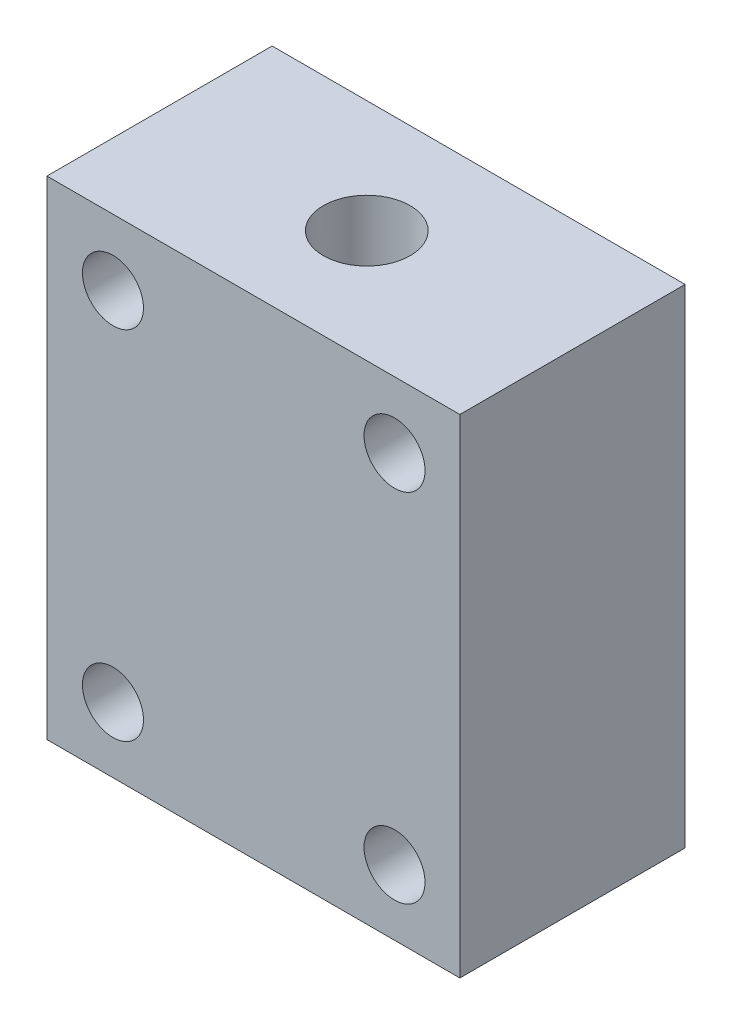
ISO-10303-21;
HEADER;
FILE_DESCRIPTION(('STEP AP214'),'2;1');
FILE_NAME('part.step','',(''),(''),'','','');
FILE_SCHEMA(('AUTOMOTIVE_DESIGN { 1 0 10303 214 1 1 1 1 }'));
ENDSEC;
DATA;
#1=APPLICATION_CONTEXT('core data for automotive mechanical design processes');
#2=APPLICATION_PROTOCOL_DEFINITION('international standard','automotive_design',2000,#1);
#3=PRODUCT_CONTEXT('',#1,'mechanical');
#4=PRODUCT('Part','Part','',(#3));
#5=PRODUCT_RELATED_PRODUCT_CATEGORY('part','',(#4));
#6=PRODUCT_DEFINITION_FORMATION('','',#4);
#7=PRODUCT_DEFINITION_CONTEXT('part definition',#1,'design');
#8=PRODUCT_DEFINITION('design','',#6,#7);
#9=PRODUCT_DEFINITION_SHAPE('','',#8);
#10=(LENGTH_UNIT() NAMED_UNIT(*) SI_UNIT(.MILLI.,.METRE.));
#11=(NAMED_UNIT(*) PLANE_ANGLE_UNIT() SI_UNIT($,.RADIAN.));
#12=(NAMED_UNIT(*) SI_UNIT($,.STERADIAN.) SOLID_ANGLE_UNIT());
#13=UNCERTAINTY_MEASURE_WITH_UNIT(LENGTH_MEASURE(1.E-05),#10,'distance_accuracy_value','');
#14=(GEOMETRIC_REPRESENTATION_CONTEXT(3) GLOBAL_UNCERTAINTY_ASSIGNED_CONTEXT((#13)) GLOBAL_UNIT_ASSIGNED_CONTEXT((#10,
#11,#12)) REPRESENTATION_CONTEXT('',''));
#15=CARTESIAN_POINT('',(0.,0.,0.));
#16=DIRECTION('',(0.,0.,1.));
#17=DIRECTION('',(1.,0.,0.));
#18=AXIS2_PLACEMENT_3D('',#15,#16,#17);
#19=CARTESIAN_POINT('',(34.925,41.275,19.05));
#20=DIRECTION('',(0.,-1.,0.));
#21=DIRECTION('',(0.,0.,-1.));
#22=AXIS2_PLACEMENT_3D('',#19,#20,#21);
#23=PLANE('',#22);
#24=CARTESIAN_POINT('',(0.126999999999997,41.275,0.));
#25=DIRECTION('',(0.,1.,0.));
#26=DIRECTION('',(0.,0.,1.));
#27=AXIS2_PLACEMENT_3D('',#24,#25,#26);
#28=CIRCLE('',#27,7.3421875);
#29=CARTESIAN_POINT('',(0.126999999999997,41.275,7.3421875));
#30=VERTEX_POINT('',#29);
#31=EDGE_CURVE('E227',#30,#30,#28,.T.);
#32=ORIENTED_EDGE('',*,*,#31,.F.);
#33=EDGE_LOOP('',(#32));
#34=FACE_BOUND('',#33,.T.);
#35=DIRECTION('',(-1.,0.,0.));
#36=VECTOR('',#35,1.);
#37=CARTESIAN_POINT('',(34.925,41.275,-19.05));
#38=LINE('',#37,#36);
#39=CARTESIAN_POINT('',(34.925,41.275,-19.05));
#40=VERTEX_POINT('',#39);
#41=CARTESIAN_POINT('',(-34.925,41.275,-19.05));
#42=VERTEX_POINT('',#41);
#43=EDGE_CURVE('E181',#40,#42,#38,.T.);
#44=ORIENTED_EDGE('',*,*,#43,.T.);
#45=DIRECTION('',(0.,0.,-1.));
#46=VECTOR('',#45,1.);
#47=CARTESIAN_POINT('',(-34.925,41.275,19.05));
#48=LINE('',#47,#46);
#49=CARTESIAN_POINT('',(-34.925,41.275,19.05));
#50=VERTEX_POINT('',#49);
#51=EDGE_CURVE('E210',#50,#42,#48,.T.);
#52=ORIENTED_EDGE('',*,*,#51,.F.);
#53=DIRECTION('',(-1.,0.,0.));
#54=VECTOR('',#53,1.);
#55=CARTESIAN_POINT('',(34.925,41.275,19.05));
#56=LINE('',#55,#54);
#57=CARTESIAN_POINT('',(34.925,41.275,19.05));
#58=VERTEX_POINT('',#57);
#59=EDGE_CURVE('E184',#58,#50,#56,.T.);
#60=ORIENTED_EDGE('',*,*,#59,.F.);
#61=DIRECTION('',(0.,0.,-1.));
#62=VECTOR('',#61,1.);
#63=CARTESIAN_POINT('',(34.925,41.275,19.05));
#64=LINE('',#63,#62);
#65=EDGE_CURVE('E194',#58,#40,#64,.T.);
#66=ORIENTED_EDGE('',*,*,#65,.T.);
#67=EDGE_LOOP('',(#44,#52,#60,#66));
#68=FACE_BOUND('',#67,.T.);
#69=ADVANCED_FACE('F43',(#34,#68),#23,.F.);
#70=CARTESIAN_POINT('',(-34.925,-41.275,19.05));
#71=DIRECTION('',(1.,0.,0.));
#72=DIRECTION('',(0.,0.,-1.));
#73=AXIS2_PLACEMENT_3D('',#70,#71,#72);
#74=PLANE('',#73);
#75=DIRECTION('',(0.,-1.,0.));
#76=VECTOR('',#75,1.);
#77=CARTESIAN_POINT('',(-34.925,-41.275,-19.05));
#78=LINE('',#77,#76);
#79=CARTESIAN_POINT('',(-34.925,-41.275,-19.05));
#80=VERTEX_POINT('',#79);
#81=EDGE_CURVE('E197',#42,#80,#78,.T.);
#82=ORIENTED_EDGE('',*,*,#81,.T.);
#83=DIRECTION('',(0.,0.,-1.));
#84=VECTOR('',#83,1.);
#85=CARTESIAN_POINT('',(-34.925,-41.275,19.05));
#86=LINE('',#85,#84);
#87=CARTESIAN_POINT('',(-34.925,-41.275,19.05));
#88=VERTEX_POINT('',#87);
#89=EDGE_CURVE('E207',#88,#80,#86,.T.);
#90=ORIENTED_EDGE('',*,*,#89,.F.);
#91=DIRECTION('',(0.,-1.,0.));
#92=VECTOR('',#91,1.);
#93=CARTESIAN_POINT('',(-34.925,-41.275,19.05));
#94=LINE('',#93,#92);
#95=EDGE_CURVE('E187',#50,#88,#94,.T.);
#96=ORIENTED_EDGE('',*,*,#95,.F.);
#97=ORIENTED_EDGE('',*,*,#51,.T.);
#98=EDGE_LOOP('',(#82,#90,#96,#97));
#99=FACE_BOUND('',#98,.T.);
#100=ADVANCED_FACE('F235',(#99),#74,.F.);
#101=CARTESIAN_POINT('',(34.925,-41.275,19.05));
#102=DIRECTION('',(0.,1.,0.));
#103=DIRECTION('',(0.,0.,1.));
#104=AXIS2_PLACEMENT_3D('',#101,#102,#103);
#105=PLANE('',#104);
#106=DIRECTION('',(1.,0.,0.));
#107=VECTOR('',#106,1.);
#108=CARTESIAN_POINT('',(34.925,-41.275,-19.05));
#109=LINE('',#108,#107);
#110=CARTESIAN_POINT('',(34.925,-41.275,-19.05));
#111=VERTEX_POINT('',#110);
#112=EDGE_CURVE('E199',#80,#111,#109,.T.);
#113=ORIENTED_EDGE('',*,*,#112,.T.);
#114=DIRECTION('',(0.,0.,-1.));
#115=VECTOR('',#114,1.);
#116=CARTESIAN_POINT('',(34.925,-41.275,19.05));
#117=LINE('',#116,#115);
#118=CARTESIAN_POINT('',(34.925,-41.275,19.05));
#119=VERTEX_POINT('',#118);
#120=EDGE_CURVE('E204',#119,#111,#117,.T.);
#121=ORIENTED_EDGE('',*,*,#120,.F.);
#122=DIRECTION('',(1.,0.,0.));
#123=VECTOR('',#122,1.);
#124=CARTESIAN_POINT('',(34.925,-41.275,19.05));
#125=LINE('',#124,#123);
#126=EDGE_CURVE('E190',#88,#119,#125,.T.);
#127=ORIENTED_EDGE('',*,*,#126,.F.);
#128=ORIENTED_EDGE('',*,*,#89,.T.);
#129=EDGE_LOOP('',(#113,#121,#127,#128));
#130=FACE_BOUND('',#129,.T.);
#131=ADVANCED_FACE('F254',(#130),#105,.F.);
#132=CARTESIAN_POINT('',(34.925,-41.275,19.05));
#133=DIRECTION('',(-1.,0.,0.));
#134=DIRECTION('',(0.,0.,1.));
#135=AXIS2_PLACEMENT_3D('',#132,#133,#134);
#136=PLANE('',#135);
#137=DIRECTION('',(0.,1.,0.));
#138=VECTOR('',#137,1.);
#139=CARTESIAN_POINT('',(34.925,-41.275,-19.05));
#140=LINE('',#139,#138);
#141=EDGE_CURVE('E188',#111,#40,#140,.T.);
#142=ORIENTED_EDGE('',*,*,#141,.T.);
#143=ORIENTED_EDGE('',*,*,#65,.F.);
#144=DIRECTION('',(0.,1.,0.));
#145=VECTOR('',#144,1.);
#146=CARTESIAN_POINT('',(34.925,-41.275,19.05));
#147=LINE('',#146,#145);
#148=EDGE_CURVE('E192',#119,#58,#147,.T.);
#149=ORIENTED_EDGE('',*,*,#148,.F.);
#150=ORIENTED_EDGE('',*,*,#120,.T.);
#151=EDGE_LOOP('',(#142,#143,#149,#150));
#152=FACE_BOUND('',#151,.T.);
#153=ADVANCED_FACE('F252',(#152),#136,.F.);
#154=CARTESIAN_POINT('',(0.,0.,19.05));
#155=DIRECTION('',(0.,0.,-1.));
#156=DIRECTION('',(-1.,0.,0.));
#157=AXIS2_PLACEMENT_3D('',#154,#155,#156);
#158=PLANE('',#157);
#159=CARTESIAN_POINT('',(23.876,30.099,19.05));
#160=DIRECTION('',(0.,0.,-1.));
#161=DIRECTION('',(-1.,0.,0.));
#162=AXIS2_PLACEMENT_3D('',#159,#160,#161);
#163=CIRCLE('',#162,5.159375);
#164=CARTESIAN_POINT('',(18.716625,30.099,19.05));
#165=VERTEX_POINT('',#164);
#166=EDGE_CURVE('E164',#165,#165,#163,.T.);
#167=ORIENTED_EDGE('',*,*,#166,.T.);
#168=EDGE_LOOP('',(#167));
#169=FACE_BOUND('',#168,.T.);
#170=CARTESIAN_POINT('',(-23.749,-30.226,19.05));
#171=DIRECTION('',(0.,0.,-1.));
#172=DIRECTION('',(-1.,0.,0.));
#173=AXIS2_PLACEMENT_3D('',#170,#171,#172);
#174=CIRCLE('',#173,5.159375);
#175=CARTESIAN_POINT('',(-28.908375,-30.226,19.05));
#176=VERTEX_POINT('',#175);
#177=EDGE_CURVE('E167',#176,#176,#174,.T.);
#178=ORIENTED_EDGE('',*,*,#177,.T.);
#179=EDGE_LOOP('',(#178));
#180=FACE_BOUND('',#179,.T.);
#181=CARTESIAN_POINT('',(-23.749,30.099,19.05));
#182=DIRECTION('',(0.,0.,-1.));
#183=DIRECTION('',(-1.,0.,0.));
#184=AXIS2_PLACEMENT_3D('',#181,#182,#183);
#185=CIRCLE('',#184,5.159375);
#186=CARTESIAN_POINT('',(-28.908375,30.099,19.05));
#187=VERTEX_POINT('',#186);
#188=EDGE_CURVE('E173',#187,#187,#185,.T.);
#189=ORIENTED_EDGE('',*,*,#188,.T.);
#190=EDGE_LOOP('',(#189));
#191=FACE_BOUND('',#190,.T.);
#192=CARTESIAN_POINT('',(23.876,-30.226,19.05));
#193=DIRECTION('',(0.,0.,-1.));
#194=DIRECTION('',(-1.,0.,0.));
#195=AXIS2_PLACEMENT_3D('',#192,#193,#194);
#196=CIRCLE('',#195,5.159375);
#197=CARTESIAN_POINT('',(18.716625,-30.226,19.05));
#198=VERTEX_POINT('',#197);
#199=EDGE_CURVE('E163',#198,#198,#196,.T.);
#200=ORIENTED_EDGE('',*,*,#199,.T.);
#201=EDGE_LOOP('',(#200));
#202=FACE_BOUND('',#201,.T.);
#203=ORIENTED_EDGE('',*,*,#59,.T.);
#204=ORIENTED_EDGE('',*,*,#95,.T.);
#205=ORIENTED_EDGE('',*,*,#126,.T.);
#206=ORIENTED_EDGE('',*,*,#148,.T.);
#207=EDGE_LOOP('',(#203,#204,#205,#206));
#208=FACE_BOUND('',#207,.T.);
#209=ADVANCED_FACE('F248',(#169,#180,#191,#202,#208),#158,.F.);
#210=CARTESIAN_POINT('',(0.,0.,-19.05));
#211=DIRECTION('',(0.,0.,-1.));
#212=DIRECTION('',(-1.,0.,0.));
#213=AXIS2_PLACEMENT_3D('',#210,#211,#212);
#214=PLANE('',#213);
#215=CARTESIAN_POINT('',(0.126999999999997,17.399,-19.05));
#216=DIRECTION('',(0.,0.,1.));
#217=DIRECTION('',(1.,0.,0.));
#218=AXIS2_PLACEMENT_3D('',#215,#216,#217);
#219=CIRCLE('',#218,12.7254);
#220=CARTESIAN_POINT('',(12.8524,17.399,-19.05));
#221=VERTEX_POINT('',#220);
#222=EDGE_CURVE('E136',#221,#221,#219,.T.);
#223=ORIENTED_EDGE('',*,*,#222,.T.);
#224=EDGE_LOOP('',(#223));
#225=FACE_BOUND('',#224,.T.);
#226=CARTESIAN_POINT('',(0.126999999999997,-17.653,-19.05));
#227=DIRECTION('',(0.,0.,1.));
#228=DIRECTION('',(1.,0.,0.));
#229=AXIS2_PLACEMENT_3D('',#226,#227,#228);
#230=CIRCLE('',#229,12.7254);
#231=CARTESIAN_POINT('',(12.8524,-17.653,-19.05));
#232=VERTEX_POINT('',#231);
#233=EDGE_CURVE('E149',#232,#232,#230,.T.);
#234=ORIENTED_EDGE('',*,*,#233,.T.);
#235=EDGE_LOOP('',(#234));
#236=FACE_BOUND('',#235,.T.);
#237=CARTESIAN_POINT('',(23.876,30.099,-19.05));
#238=DIRECTION('',(0.,0.,1.));
#239=DIRECTION('',(1.,0.,0.));
#240=AXIS2_PLACEMENT_3D('',#237,#238,#239);
#241=CIRCLE('',#240,5.159375);
#242=CARTESIAN_POINT('',(29.035375,30.099,-19.05));
#243=VERTEX_POINT('',#242);
#244=EDGE_CURVE('E160',#243,#243,#241,.T.);
#245=ORIENTED_EDGE('',*,*,#244,.T.);
#246=EDGE_LOOP('',(#245));
#247=FACE_BOUND('',#246,.T.);
#248=CARTESIAN_POINT('',(-23.749,-30.226,-19.05));
#249=DIRECTION('',(0.,0.,1.));
#250=DIRECTION('',(1.,0.,0.));
#251=AXIS2_PLACEMENT_3D('',#248,#249,#250);
#252=CIRCLE('',#251,5.159375);
#253=CARTESIAN_POINT('',(-18.589625,-30.226,-19.05));
#254=VERTEX_POINT('',#253);
#255=EDGE_CURVE('E170',#254,#254,#252,.T.);
#256=ORIENTED_EDGE('',*,*,#255,.T.);
#257=EDGE_LOOP('',(#256));
#258=FACE_BOUND('',#257,.T.);
#259=CARTESIAN_POINT('',(-23.749,30.099,-19.05));
#260=DIRECTION('',(0.,0.,1.));
#261=DIRECTION('',(1.,0.,0.));
#262=AXIS2_PLACEMENT_3D('',#259,#260,#261);
#263=CIRCLE('',#262,5.159375);
#264=CARTESIAN_POINT('',(-18.589625,30.099,-19.05));
#265=VERTEX_POINT('',#264);
#266=EDGE_CURVE('E159',#265,#265,#263,.T.);
#267=ORIENTED_EDGE('',*,*,#266,.T.);
#268=EDGE_LOOP('',(#267));
#269=FACE_BOUND('',#268,.T.);
#270=CARTESIAN_POINT('',(23.876,-30.226,-19.05));
#271=DIRECTION('',(0.,0.,1.));
#272=DIRECTION('',(1.,0.,0.));
#273=AXIS2_PLACEMENT_3D('',#270,#271,#272);
#274=CIRCLE('',#273,5.159375);
#275=CARTESIAN_POINT('',(29.035375,-30.226,-19.05));
#276=VERTEX_POINT('',#275);
#277=EDGE_CURVE('E178',#276,#276,#274,.T.);
#278=ORIENTED_EDGE('',*,*,#277,.T.);
#279=EDGE_LOOP('',(#278));
#280=FACE_BOUND('',#279,.T.);
#281=ORIENTED_EDGE('',*,*,#43,.F.);
#282=ORIENTED_EDGE('',*,*,#141,.F.);
#283=ORIENTED_EDGE('',*,*,#112,.F.);
#284=ORIENTED_EDGE('',*,*,#81,.F.);
#285=EDGE_LOOP('',(#281,#282,#283,#284));
#286=FACE_BOUND('',#285,.T.);
#287=ADVANCED_FACE('F242',(#225,#236,#247,#258,#269,#280,#286),#214,.T.);
#288=CARTESIAN_POINT('',(23.876,-30.226,19.051));
#289=DIRECTION('',(0.,0.,-1.));
#290=DIRECTION('',(-1.,0.,0.));
#291=AXIS2_PLACEMENT_3D('',#288,#289,#290);
#292=CYLINDRICAL_SURFACE('',#291,5.159375);
#293=ORIENTED_EDGE('',*,*,#277,.F.);
#294=EDGE_LOOP('',(#293));
#295=FACE_BOUND('',#294,.T.);
#296=ORIENTED_EDGE('',*,*,#199,.F.);
#297=EDGE_LOOP('',(#296));
#298=FACE_BOUND('',#297,.T.);
#299=ADVANCED_FACE('F265',(#295,#298),#292,.F.);
#300=CARTESIAN_POINT('',(-23.749,30.099,19.051));
#301=DIRECTION('',(0.,0.,-1.));
#302=DIRECTION('',(-1.,0.,0.));
#303=AXIS2_PLACEMENT_3D('',#300,#301,#302);
#304=CYLINDRICAL_SURFACE('',#303,5.159375);
#305=ORIENTED_EDGE('',*,*,#266,.F.);
#306=EDGE_LOOP('',(#305));
#307=FACE_BOUND('',#306,.T.);
#308=ORIENTED_EDGE('',*,*,#188,.F.);
#309=EDGE_LOOP('',(#308));
#310=FACE_BOUND('',#309,.T.);
#311=ADVANCED_FACE('F271',(#307,#310),#304,.F.);
#312=CARTESIAN_POINT('',(-23.749,-30.226,19.051));
#313=DIRECTION('',(0.,0.,-1.));
#314=DIRECTION('',(-1.,0.,0.));
#315=AXIS2_PLACEMENT_3D('',#312,#313,#314);
#316=CYLINDRICAL_SURFACE('',#315,5.159375);
#317=ORIENTED_EDGE('',*,*,#255,.F.);
#318=EDGE_LOOP('',(#317));
#319=FACE_BOUND('',#318,.T.);
#320=ORIENTED_EDGE('',*,*,#177,.F.);
#321=EDGE_LOOP('',(#320));
#322=FACE_BOUND('',#321,.T.);
#323=ADVANCED_FACE('F275',(#319,#322),#316,.F.);
#324=CARTESIAN_POINT('',(23.876,30.099,19.051));
#325=DIRECTION('',(0.,0.,-1.));
#326=DIRECTION('',(-1.,0.,0.));
#327=AXIS2_PLACEMENT_3D('',#324,#325,#326);
#328=CYLINDRICAL_SURFACE('',#327,5.159375);
#329=ORIENTED_EDGE('',*,*,#244,.F.);
#330=EDGE_LOOP('',(#329));
#331=FACE_BOUND('',#330,.T.);
#332=ORIENTED_EDGE('',*,*,#166,.F.);
#333=EDGE_LOOP('',(#332));
#334=FACE_BOUND('',#333,.T.);
#335=ADVANCED_FACE('F279',(#331,#334),#328,.F.);
#336=CARTESIAN_POINT('',(0.126999999999997,-17.653,-16.2306));
#337=DIRECTION('',(0.,0.,-1.));
#338=DIRECTION('',(-1.,0.,0.));
#339=AXIS2_PLACEMENT_3D('',#336,#337,#338);
#340=CYLINDRICAL_SURFACE('',#339,12.7254);
#341=CARTESIAN_POINT('',(0.126999999999997,-17.653,-16.2306));
#342=DIRECTION('',(0.,0.,1.));
#343=DIRECTION('',(1.,0.,0.));
#344=AXIS2_PLACEMENT_3D('',#341,#342,#343);
#345=CIRCLE('',#344,12.7254);
#346=CARTESIAN_POINT('',(12.8524,-17.653,-16.2306));
#347=VERTEX_POINT('',#346);
#348=EDGE_CURVE('E150',#347,#347,#345,.T.);
#349=ORIENTED_EDGE('',*,*,#348,.T.);
#350=EDGE_LOOP('',(#349));
#351=FACE_BOUND('',#350,.T.);
#352=ORIENTED_EDGE('',*,*,#233,.F.);
#353=EDGE_LOOP('',(#352));
#354=FACE_BOUND('',#353,.T.);
#355=ADVANCED_FACE('F283',(#351,#354),#340,.F.);
#356=CARTESIAN_POINT('',(0.126999999999997,-17.653,-16.2306));
#357=DIRECTION('',(0.,0.,1.));
#358=DIRECTION('',(1.,0.,0.));
#359=AXIS2_PLACEMENT_3D('',#356,#357,#358);
#360=PLANE('',#359);
#361=CARTESIAN_POINT('',(0.126999999999997,-17.653,-16.2306));
#362=DIRECTION('',(0.,0.,1.));
#363=DIRECTION('',(1.,0.,0.));
#364=AXIS2_PLACEMENT_3D('',#361,#362,#363);
#365=CIRCLE('',#364,7.3421875);
#366=CARTESIAN_POINT('',(7.4691875,-17.653,-16.2306));
#367=VERTEX_POINT('',#366);
#368=EDGE_CURVE('E153',#367,#367,#365,.T.);
#369=ORIENTED_EDGE('',*,*,#368,.T.);
#370=EDGE_LOOP('',(#369));
#371=FACE_BOUND('',#370,.T.);
#372=ORIENTED_EDGE('',*,*,#348,.F.);
#373=EDGE_LOOP('',(#372));
#374=FACE_BOUND('',#373,.T.);
#375=ADVANCED_FACE('F291',(#371,#374),#360,.F.);
#376=CARTESIAN_POINT('',(0.126999999999997,-17.653,9.398));
#377=DIRECTION('',(0.,0.,1.));
#378=DIRECTION('',(1.,0.,0.));
#379=AXIS2_PLACEMENT_3D('',#376,#377,#378);
#380=PLANE('',#379);
#381=CARTESIAN_POINT('',(0.126999999999997,-17.653,9.398));
#382=DIRECTION('',(0.,0.,1.));
#383=DIRECTION('',(1.,0.,0.));
#384=AXIS2_PLACEMENT_3D('',#381,#382,#383);
#385=CIRCLE('',#384,7.3421875);
#386=CARTESIAN_POINT('',(7.4691875,-17.653,9.398));
#387=VERTEX_POINT('',#386);
#388=EDGE_CURVE('E156',#387,#387,#385,.T.);
#389=ORIENTED_EDGE('',*,*,#388,.F.);
#390=EDGE_LOOP('',(#389));
#391=FACE_BOUND('',#390,.T.);
#392=ADVANCED_FACE('F288',(#391),#380,.F.);
#393=CARTESIAN_POINT('',(0.126999999999997,-17.653,9.398));
#394=DIRECTION('',(0.,0.,-1.));
#395=DIRECTION('',(-1.,0.,0.));
#396=AXIS2_PLACEMENT_3D('',#393,#394,#395);
#397=CYLINDRICAL_SURFACE('',#396,7.3421875);
#398=CARTESIAN_POINT('',(0.126999999999997,-17.653,0.));
#399=DIRECTION('',(0.,-0.707106781186547,-0.707106781186547));
#400=DIRECTION('',(0.,0.707106781186547,-0.707106781186547));
#401=AXIS2_PLACEMENT_3D('',#398,#399,#400);
#402=ELLIPSE('',#401,10.3834211399862,7.3421875);
#403=CARTESIAN_POINT('',(7.30927967188387,-19.177,1.52399999999999));
#404=VERTEX_POINT('',#403);
#405=CARTESIAN_POINT('',(7.4691875,-17.653,0.));
#406=VERTEX_POINT('',#405);
#407=EDGE_CURVE('E57',#404,#406,#402,.F.);
#408=ORIENTED_EDGE('',*,*,#407,.F.);
#409=DIRECTION('',(0.,0.,-1.));
#410=VECTOR('',#409,1.);
#411=CARTESIAN_POINT('',(7.30927967188387,-19.177,9.398));
#412=LINE('',#411,#410);
#413=CARTESIAN_POINT('',(7.30927967188387,-19.177,-1.52399999999999));
#414=VERTEX_POINT('',#413);
#415=EDGE_CURVE('E11',#404,#414,#412,.T.);
#416=ORIENTED_EDGE('',*,*,#415,.T.);
#417=CARTESIAN_POINT('',(0.126999999999997,-17.653,0.));
#418=DIRECTION('',(0.,0.707106781186547,-0.707106781186547));
#419=DIRECTION('',(0.,-0.707106781186547,-0.707106781186547));
#420=AXIS2_PLACEMENT_3D('',#417,#418,#419);
#421=ELLIPSE('',#420,10.3834211399862,7.3421875);
#422=EDGE_CURVE('E113',#406,#414,#421,.T.);
#423=ORIENTED_EDGE('',*,*,#422,.F.);
#424=CARTESIAN_POINT('',(0.126999999999997,-17.653,0.));
#425=DIRECTION('',(0.,-0.707106781186547,-0.707106781186547));
#426=DIRECTION('',(0.,0.707106781186547,-0.707106781186547));
#427=AXIS2_PLACEMENT_3D('',#424,#425,#426);
#428=ELLIPSE('',#427,10.3834211399862,7.3421875);
#429=CARTESIAN_POINT('',(-7.2151875,-17.653,0.));
#430=VERTEX_POINT('',#429);
#431=EDGE_CURVE('E121',#430,#406,#428,.T.);
#432=ORIENTED_EDGE('',*,*,#431,.F.);
#433=CARTESIAN_POINT('',(-7.05527967188387,-19.177,-1.52399999999999));
#434=VERTEX_POINT('',#433);
#435=EDGE_CURVE('E124',#434,#430,#421,.T.);
#436=ORIENTED_EDGE('',*,*,#435,.F.);
#437=DIRECTION('',(0.,0.,-1.));
#438=VECTOR('',#437,1.);
#439=CARTESIAN_POINT('',(-7.05527967188387,-19.177,9.398));
#440=LINE('',#439,#438);
#441=CARTESIAN_POINT('',(-7.05527967188387,-19.177,1.52399999999999));
#442=VERTEX_POINT('',#441);
#443=EDGE_CURVE('E50',#434,#442,#440,.F.);
#444=ORIENTED_EDGE('',*,*,#443,.T.);
#445=EDGE_CURVE('E123',#430,#442,#402,.F.);
#446=ORIENTED_EDGE('',*,*,#445,.F.);
#447=CARTESIAN_POINT('',(0.126999999999997,-17.653,0.));
#448=DIRECTION('',(0.,0.707106781186547,-0.707106781186547));
#449=DIRECTION('',(0.,-0.707106781186547,-0.707106781186547));
#450=AXIS2_PLACEMENT_3D('',#447,#448,#449);
#451=ELLIPSE('',#450,10.3834211399862,7.3421875);
#452=EDGE_CURVE('E120',#406,#430,#451,.F.);
#453=ORIENTED_EDGE('',*,*,#452,.F.);
#454=EDGE_LOOP('',(#408,#416,#423,#432,#436,#444,#446,#453));
#455=FACE_BOUND('',#454,.T.);
#456=ORIENTED_EDGE('',*,*,#368,.F.);
#457=EDGE_LOOP('',(#456));
#458=FACE_BOUND('',#457,.T.);
#459=ORIENTED_EDGE('',*,*,#388,.T.);
#460=EDGE_LOOP('',(#459));
#461=FACE_BOUND('',#460,.T.);
#462=ADVANCED_FACE('F117',(#455,#458,#461),#397,.F.);
#463=CARTESIAN_POINT('',(0.126999999999997,17.399,-16.2306));
#464=DIRECTION('',(0.,0.,-1.));
#465=DIRECTION('',(-1.,0.,0.));
#466=AXIS2_PLACEMENT_3D('',#463,#464,#465);
#467=CYLINDRICAL_SURFACE('',#466,12.7254);
#468=CARTESIAN_POINT('',(0.126999999999997,17.399,-16.2306));
#469=DIRECTION('',(0.,0.,1.));
#470=DIRECTION('',(1.,0.,0.));
#471=AXIS2_PLACEMENT_3D('',#468,#469,#470);
#472=CIRCLE('',#471,12.7254);
#473=CARTESIAN_POINT('',(12.8524,17.399,-16.2306));
#474=VERTEX_POINT('',#473);
#475=EDGE_CURVE('E138',#474,#474,#472,.T.);
#476=ORIENTED_EDGE('',*,*,#475,.T.);
#477=EDGE_LOOP('',(#476));
#478=FACE_BOUND('',#477,.T.);
#479=ORIENTED_EDGE('',*,*,#222,.F.);
#480=EDGE_LOOP('',(#479));
#481=FACE_BOUND('',#480,.T.);
#482=ADVANCED_FACE('F287',(#478,#481),#467,.F.);
#483=CARTESIAN_POINT('',(0.126999999999997,17.399,-16.2306));
#484=DIRECTION('',(0.,0.,1.));
#485=DIRECTION('',(1.,0.,0.));
#486=AXIS2_PLACEMENT_3D('',#483,#484,#485);
#487=PLANE('',#486);
#488=CARTESIAN_POINT('',(0.126999999999997,17.399,-16.2306));
#489=DIRECTION('',(0.,0.,1.));
#490=DIRECTION('',(1.,0.,0.));
#491=AXIS2_PLACEMENT_3D('',#488,#489,#490);
#492=CIRCLE('',#491,7.3421875);
#493=CARTESIAN_POINT('',(7.4691875,17.399,-16.2306));
#494=VERTEX_POINT('',#493);
#495=EDGE_CURVE('E143',#494,#494,#492,.T.);
#496=ORIENTED_EDGE('',*,*,#495,.T.);
#497=EDGE_LOOP('',(#496));
#498=FACE_BOUND('',#497,.T.);
#499=ORIENTED_EDGE('',*,*,#475,.F.);
#500=EDGE_LOOP('',(#499));
#501=FACE_BOUND('',#500,.T.);
#502=ADVANCED_FACE('F303',(#498,#501),#487,.F.);
#503=CARTESIAN_POINT('',(0.126999999999997,17.399,9.398));
#504=DIRECTION('',(0.,0.,-1.));
#505=DIRECTION('',(-1.,0.,0.));
#506=AXIS2_PLACEMENT_3D('',#503,#504,#505);
#507=CYLINDRICAL_SURFACE('',#506,7.3421875);
#508=CARTESIAN_POINT('',(0.126999999999997,17.399,0.));
#509=DIRECTION('',(0.,0.707106781186547,-0.707106781186547));
#510=DIRECTION('',(0.,-0.707106781186547,-0.707106781186547));
#511=AXIS2_PLACEMENT_3D('',#508,#509,#510);
#512=ELLIPSE('',#511,10.3834211399862,7.3421875);
#513=CARTESIAN_POINT('',(7.4691875,17.399,0.));
#514=VERTEX_POINT('',#513);
#515=CARTESIAN_POINT('',(-7.2151875,17.399,0.));
#516=VERTEX_POINT('',#515);
#517=EDGE_CURVE('E220',#514,#516,#512,.T.);
#518=ORIENTED_EDGE('',*,*,#517,.F.);
#519=CARTESIAN_POINT('',(0.126999999999997,17.399,0.));
#520=DIRECTION('',(0.,-0.707106781186547,-0.707106781186547));
#521=DIRECTION('',(0.,0.707106781186547,-0.707106781186547));
#522=AXIS2_PLACEMENT_3D('',#519,#520,#521);
#523=ELLIPSE('',#522,10.3834211399862,7.3421875);
#524=EDGE_CURVE('E218',#516,#514,#523,.T.);
#525=ORIENTED_EDGE('',*,*,#524,.F.);
#526=EDGE_LOOP('',(#518,#525));
#527=FACE_BOUND('',#526,.T.);
#528=ORIENTED_EDGE('',*,*,#495,.F.);
#529=EDGE_LOOP('',(#528));
#530=FACE_BOUND('',#529,.T.);
#531=ADVANCED_FACE('F299',(#527,#530),#507,.F.);
#532=CARTESIAN_POINT('',(0.126999999999997,-19.177,0.));
#533=DIRECTION('',(0.,1.,0.));
#534=DIRECTION('',(0.,0.,1.));
#535=AXIS2_PLACEMENT_3D('',#532,#533,#534);
#536=CYLINDRICAL_SURFACE('',#535,7.3421875);
#537=ORIENTED_EDGE('',*,*,#452,.T.);
#538=ORIENTED_EDGE('',*,*,#431,.T.);
#539=EDGE_LOOP('',(#537,#538));
#540=FACE_BOUND('',#539,.T.);
#541=ORIENTED_EDGE('',*,*,#517,.T.);
#542=CARTESIAN_POINT('',(0.126999999999997,17.399,0.));
#543=DIRECTION('',(0.,-0.707106781186547,-0.707106781186547));
#544=DIRECTION('',(0.,0.707106781186547,-0.707106781186547));
#545=AXIS2_PLACEMENT_3D('',#542,#543,#544);
#546=ELLIPSE('',#545,10.3834211399862,7.3421875);
#547=EDGE_CURVE('E64',#516,#514,#546,.F.);
#548=ORIENTED_EDGE('',*,*,#547,.T.);
#549=EDGE_LOOP('',(#541,#548));
#550=FACE_BOUND('',#549,.T.);
#551=ADVANCED_FACE('F302',(#540,#550),#536,.F.);
#552=CARTESIAN_POINT('',(0.126999999999997,17.399,0.));
#553=DIRECTION('',(0.,0.707106781186547,-0.707106781186547));
#554=DIRECTION('',(0.,-0.707106781186547,-0.707106781186547));
#555=AXIS2_PLACEMENT_3D('',#552,#553,#554);
#556=ELLIPSE('',#555,10.3834211399862,7.3421875);
#557=EDGE_CURVE('E222',#514,#516,#556,.F.);
#558=ORIENTED_EDGE('',*,*,#557,.T.);
#559=ORIENTED_EDGE('',*,*,#524,.T.);
#560=EDGE_LOOP('',(#558,#559));
#561=FACE_BOUND('',#560,.T.);
#562=ORIENTED_EDGE('',*,*,#31,.T.);
#563=EDGE_LOOP('',(#562));
#564=FACE_BOUND('',#563,.T.);
#565=ADVANCED_FACE('F231',(#561,#564),#536,.F.);
#566=CARTESIAN_POINT('',(0.126999999999997,-19.177,0.));
#567=DIRECTION('',(0.,1.,0.));
#568=DIRECTION('',(0.,0.,1.));
#569=AXIS2_PLACEMENT_3D('',#566,#567,#568);
#570=PLANE('',#569);
#571=CARTESIAN_POINT('',(0.126999999999997,-19.177,0.));
#572=DIRECTION('',(0.,1.,0.));
#573=DIRECTION('',(0.,0.,1.));
#574=AXIS2_PLACEMENT_3D('',#571,#572,#573);
#575=CIRCLE('',#574,7.3421875);
#576=EDGE_CURVE('E114',#434,#442,#575,.T.);
#577=ORIENTED_EDGE('',*,*,#576,.T.);
#578=ORIENTED_EDGE('',*,*,#443,.F.);
#579=EDGE_LOOP('',(#577,#578));
#580=FACE_BOUND('',#579,.T.);
#581=ADVANCED_FACE('F225',(#580),#570,.T.);
#582=ORIENTED_EDGE('',*,*,#445,.T.);
#583=ORIENTED_EDGE('',*,*,#576,.F.);
#584=ORIENTED_EDGE('',*,*,#435,.T.);
#585=EDGE_LOOP('',(#582,#583,#584));
#586=FACE_BOUND('',#585,.T.);
#587=ADVANCED_FACE('F226',(#586),#536,.F.);
#588=EDGE_CURVE('E109',#404,#414,#575,.T.);
#589=ORIENTED_EDGE('',*,*,#588,.T.);
#590=ORIENTED_EDGE('',*,*,#415,.F.);
#591=EDGE_LOOP('',(#589,#590));
#592=FACE_BOUND('',#591,.T.);
#593=ADVANCED_FACE('F108',(#592),#570,.T.);
#594=ORIENTED_EDGE('',*,*,#422,.T.);
#595=ORIENTED_EDGE('',*,*,#588,.F.);
#596=ORIENTED_EDGE('',*,*,#407,.T.);
#597=EDGE_LOOP('',(#594,#595,#596));
#598=FACE_BOUND('',#597,.T.);
#599=ADVANCED_FACE('F112',(#598),#536,.F.);
#600=CARTESIAN_POINT('',(0.126999999999997,17.399,9.398));
#601=DIRECTION('',(0.,0.,1.));
#602=DIRECTION('',(1.,0.,0.));
#603=AXIS2_PLACEMENT_3D('',#600,#601,#602);
#604=PLANE('',#603);
#605=CARTESIAN_POINT('',(0.126999999999997,17.399,9.398));
#606=DIRECTION('',(0.,0.,1.));
#607=DIRECTION('',(1.,0.,0.));
#608=AXIS2_PLACEMENT_3D('',#605,#606,#607);
#609=CIRCLE('',#608,7.3421875);
#610=CARTESIAN_POINT('',(7.4691875,17.399,9.398));
#611=VERTEX_POINT('',#610);
#612=EDGE_CURVE('E146',#611,#611,#609,.T.);
#613=ORIENTED_EDGE('',*,*,#612,.F.);
#614=EDGE_LOOP('',(#613));
#615=FACE_BOUND('',#614,.T.);
#616=ADVANCED_FACE('F306',(#615),#604,.F.);
#617=ORIENTED_EDGE('',*,*,#557,.F.);
#618=ORIENTED_EDGE('',*,*,#547,.F.);
#619=EDGE_LOOP('',(#617,#618));
#620=FACE_BOUND('',#619,.T.);
#621=ORIENTED_EDGE('',*,*,#612,.T.);
#622=EDGE_LOOP('',(#621));
#623=FACE_BOUND('',#622,.T.);
#624=ADVANCED_FACE('F305',(#620,#623),#507,.F.);
#625=CLOSED_SHELL('',(#69,#100,#131,#153,#209,#287,#299,#311,#323,#335,#355,#375,#392,#462,#482,
#502,#531,#551,#565,#581,#587,#593,#599,#616,#624));
#626=MANIFOLD_SOLID_BREP('B2',#625);
#627=ADVANCED_BREP_SHAPE_REPRESENTATION('',(#18,#626),#14);
#628=SHAPE_DEFINITION_REPRESENTATION(#9,#627);
ENDSEC;
END-ISO-10303-21;
